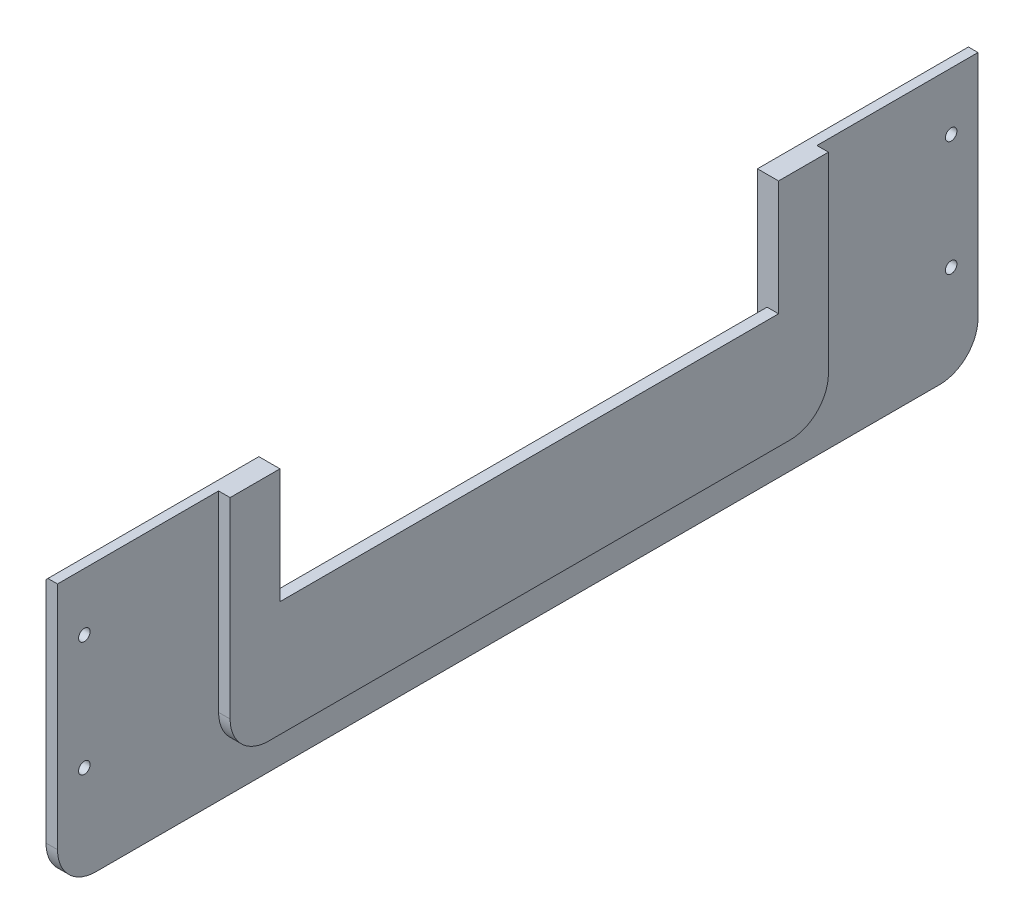
ISO-10303-21;
HEADER;
FILE_DESCRIPTION(('STEP AP214'),'2;1');
FILE_NAME('part.step','',(''),(''),'','','');
FILE_SCHEMA(('AUTOMOTIVE_DESIGN { 1 0 10303 214 1 1 1 1 }'));
ENDSEC;
DATA;
#1=APPLICATION_CONTEXT('core data for automotive mechanical design processes');
#2=APPLICATION_PROTOCOL_DEFINITION('international standard','automotive_design',2000,#1);
#3=PRODUCT_CONTEXT('',#1,'mechanical');
#4=PRODUCT('Part','Part','',(#3));
#5=PRODUCT_RELATED_PRODUCT_CATEGORY('part','',(#4));
#6=PRODUCT_DEFINITION_FORMATION('','',#4);
#7=PRODUCT_DEFINITION_CONTEXT('part definition',#1,'design');
#8=PRODUCT_DEFINITION('design','',#6,#7);
#9=PRODUCT_DEFINITION_SHAPE('','',#8);
#10=(LENGTH_UNIT() NAMED_UNIT(*) SI_UNIT(.MILLI.,.METRE.));
#11=(NAMED_UNIT(*) PLANE_ANGLE_UNIT() SI_UNIT($,.RADIAN.));
#12=(NAMED_UNIT(*) SI_UNIT($,.STERADIAN.) SOLID_ANGLE_UNIT());
#13=UNCERTAINTY_MEASURE_WITH_UNIT(LENGTH_MEASURE(1.E-05),#10,'distance_accuracy_value','');
#14=(GEOMETRIC_REPRESENTATION_CONTEXT(3) GLOBAL_UNCERTAINTY_ASSIGNED_CONTEXT((#13)) GLOBAL_UNIT_ASSIGNED_CONTEXT((#10,
#11,#12)) REPRESENTATION_CONTEXT('',''));
#15=CARTESIAN_POINT('',(0.,0.,0.));
#16=DIRECTION('',(0.,0.,1.));
#17=DIRECTION('',(1.,0.,0.));
#18=AXIS2_PLACEMENT_3D('',#15,#16,#17);
#19=CARTESIAN_POINT('',(3.,45.,120.));
#20=DIRECTION('',(0.,-1.,0.));
#21=DIRECTION('',(0.,0.,-1.));
#22=AXIS2_PLACEMENT_3D('',#19,#20,#21);
#23=PLANE('',#22);
#24=DIRECTION('',(-1.,0.,0.));
#25=VECTOR('',#24,1.);
#26=CARTESIAN_POINT('',(3.,45.,-120.));
#27=LINE('',#26,#25);
#28=CARTESIAN_POINT('',(3.,45.,-120.));
#29=VERTEX_POINT('',#28);
#30=CARTESIAN_POINT('',(0.499999999999973,45.,-120.));
#31=VERTEX_POINT('',#30);
#32=EDGE_CURVE('E348',#29,#31,#27,.T.);
#33=ORIENTED_EDGE('',*,*,#32,.T.);
#34=DIRECTION('',(0.,0.,1.));
#35=VECTOR('',#34,1.);
#36=CARTESIAN_POINT('',(0.499999999999973,45.,120.));
#37=LINE('',#36,#35);
#38=CARTESIAN_POINT('',(0.499999999999973,45.,-65.));
#39=VERTEX_POINT('',#38);
#40=EDGE_CURVE('E418',#31,#39,#37,.T.);
#41=ORIENTED_EDGE('',*,*,#40,.T.);
#42=DIRECTION('',(-1.,0.,0.));
#43=VECTOR('',#42,1.);
#44=CARTESIAN_POINT('',(3.,45.,-65.));
#45=LINE('',#44,#43);
#46=CARTESIAN_POINT('',(6.,45.,-65.));
#47=VERTEX_POINT('',#46);
#48=EDGE_CURVE('E238',#47,#39,#45,.T.);
#49=ORIENTED_EDGE('',*,*,#48,.F.);
#50=DIRECTION('',(0.,0.,1.));
#51=VECTOR('',#50,1.);
#52=CARTESIAN_POINT('',(6.,45.,78.));
#53=LINE('',#52,#51);
#54=CARTESIAN_POINT('',(6.,45.,-78.));
#55=VERTEX_POINT('',#54);
#56=EDGE_CURVE('E217',#55,#47,#53,.T.);
#57=ORIENTED_EDGE('',*,*,#56,.F.);
#58=DIRECTION('',(-1.,0.,0.));
#59=VECTOR('',#58,1.);
#60=CARTESIAN_POINT('',(6.,45.,-78.));
#61=LINE('',#60,#59);
#62=CARTESIAN_POINT('',(3.,45.,-78.));
#63=VERTEX_POINT('',#62);
#64=EDGE_CURVE('E313',#55,#63,#61,.T.);
#65=ORIENTED_EDGE('',*,*,#64,.T.);
#66=DIRECTION('',(0.,0.,1.));
#67=VECTOR('',#66,1.);
#68=CARTESIAN_POINT('',(3.,45.,120.));
#69=LINE('',#68,#67);
#70=EDGE_CURVE('E331',#29,#63,#69,.T.);
#71=ORIENTED_EDGE('',*,*,#70,.F.);
#72=EDGE_LOOP('',(#33,#41,#49,#57,#65,#71));
#73=FACE_BOUND('',#72,.T.);
#74=ADVANCED_FACE('F46',(#73),#23,.F.);
#75=CARTESIAN_POINT('',(3.,45.,120.));
#76=DIRECTION('',(0.,0.,-1.));
#77=DIRECTION('',(0.,1.,0.));
#78=AXIS2_PLACEMENT_3D('',#75,#76,#77);
#79=PLANE('',#78);
#80=DIRECTION('',(-1.,0.,0.));
#81=VECTOR('',#80,1.);
#82=CARTESIAN_POINT('',(3.,45.,120.));
#83=LINE('',#82,#81);
#84=CARTESIAN_POINT('',(3.,45.,120.));
#85=VERTEX_POINT('',#84);
#86=CARTESIAN_POINT('',(0.499999999999973,45.,120.));
#87=VERTEX_POINT('',#86);
#88=EDGE_CURVE('E335',#85,#87,#83,.T.);
#89=ORIENTED_EDGE('',*,*,#88,.T.);
#90=DIRECTION('',(0.707106781186548,0.707106781186548,0.));
#91=VECTOR('',#90,1.);
#92=CARTESIAN_POINT('',(0.499999999999973,45.,120.));
#93=LINE('',#92,#91);
#94=CARTESIAN_POINT('',(0.,44.5,120.));
#95=VERTEX_POINT('',#94);
#96=EDGE_CURVE('E409',#87,#95,#93,.F.);
#97=ORIENTED_EDGE('',*,*,#96,.T.);
#98=DIRECTION('',(0.,-1.,0.));
#99=VECTOR('',#98,1.);
#100=CARTESIAN_POINT('',(0.,45.,120.));
#101=LINE('',#100,#99);
#102=CARTESIAN_POINT('',(0.,-15.,120.));
#103=VERTEX_POINT('',#102);
#104=EDGE_CURVE('E317',#95,#103,#101,.T.);
#105=ORIENTED_EDGE('',*,*,#104,.T.);
#106=DIRECTION('',(-1.,0.,0.));
#107=VECTOR('',#106,1.);
#108=CARTESIAN_POINT('',(3.,-15.,120.));
#109=LINE('',#108,#107);
#110=CARTESIAN_POINT('',(3.,-15.,120.));
#111=VERTEX_POINT('',#110);
#112=EDGE_CURVE('E366',#103,#111,#109,.F.);
#113=ORIENTED_EDGE('',*,*,#112,.T.);
#114=DIRECTION('',(0.,-1.,0.));
#115=VECTOR('',#114,1.);
#116=CARTESIAN_POINT('',(3.,45.,120.));
#117=LINE('',#116,#115);
#118=EDGE_CURVE('E318',#85,#111,#117,.T.);
#119=ORIENTED_EDGE('',*,*,#118,.F.);
#120=EDGE_LOOP('',(#89,#97,#105,#113,#119));
#121=FACE_BOUND('',#120,.T.);
#122=ADVANCED_FACE('F510',(#121),#79,.F.);
#123=CARTESIAN_POINT('',(3.,-25.,120.));
#124=DIRECTION('',(0.,1.,0.));
#125=DIRECTION('',(0.,0.,1.));
#126=AXIS2_PLACEMENT_3D('',#123,#124,#125);
#127=PLANE('',#126);
#128=DIRECTION('',(0.,0.,-1.));
#129=VECTOR('',#128,1.);
#130=CARTESIAN_POINT('',(3.,-25.,120.));
#131=LINE('',#130,#129);
#132=CARTESIAN_POINT('',(3.,-25.,110.));
#133=VERTEX_POINT('',#132);
#134=CARTESIAN_POINT('',(3.,-25.,-110.));
#135=VERTEX_POINT('',#134);
#136=EDGE_CURVE('E322',#133,#135,#131,.T.);
#137=ORIENTED_EDGE('',*,*,#136,.F.);
#138=DIRECTION('',(-1.,0.,0.));
#139=VECTOR('',#138,1.);
#140=CARTESIAN_POINT('',(3.,-25.,110.));
#141=LINE('',#140,#139);
#142=CARTESIAN_POINT('',(0.,-25.,110.));
#143=VERTEX_POINT('',#142);
#144=EDGE_CURVE('E355',#133,#143,#141,.T.);
#145=ORIENTED_EDGE('',*,*,#144,.T.);
#146=DIRECTION('',(0.,0.,-1.));
#147=VECTOR('',#146,1.);
#148=CARTESIAN_POINT('',(0.,-25.,120.));
#149=LINE('',#148,#147);
#150=CARTESIAN_POINT('',(0.,-25.,-110.));
#151=VERTEX_POINT('',#150);
#152=EDGE_CURVE('E338',#143,#151,#149,.T.);
#153=ORIENTED_EDGE('',*,*,#152,.T.);
#154=DIRECTION('',(-1.,0.,0.));
#155=VECTOR('',#154,1.);
#156=CARTESIAN_POINT('',(3.,-25.,-110.));
#157=LINE('',#156,#155);
#158=EDGE_CURVE('E352',#151,#135,#157,.F.);
#159=ORIENTED_EDGE('',*,*,#158,.T.);
#160=EDGE_LOOP('',(#137,#145,#153,#159));
#161=FACE_BOUND('',#160,.T.);
#162=ADVANCED_FACE('F484',(#161),#127,.F.);
#163=CARTESIAN_POINT('',(3.,45.,-120.));
#164=DIRECTION('',(0.,0.,1.));
#165=DIRECTION('',(1.,0.,0.));
#166=AXIS2_PLACEMENT_3D('',#163,#164,#165);
#167=PLANE('',#166);
#168=DIRECTION('',(0.,1.,0.));
#169=VECTOR('',#168,1.);
#170=CARTESIAN_POINT('',(0.,45.,-120.));
#171=LINE('',#170,#169);
#172=CARTESIAN_POINT('',(0.,-15.,-120.));
#173=VERTEX_POINT('',#172);
#174=CARTESIAN_POINT('',(0.,44.5,-120.));
#175=VERTEX_POINT('',#174);
#176=EDGE_CURVE('E323',#173,#175,#171,.T.);
#177=ORIENTED_EDGE('',*,*,#176,.T.);
#178=DIRECTION('',(-0.707106781186548,-0.707106781186548,0.));
#179=VECTOR('',#178,1.);
#180=CARTESIAN_POINT('',(0.499999999999973,45.,-120.));
#181=LINE('',#180,#179);
#182=EDGE_CURVE('E422',#175,#31,#181,.F.);
#183=ORIENTED_EDGE('',*,*,#182,.T.);
#184=ORIENTED_EDGE('',*,*,#32,.F.);
#185=DIRECTION('',(0.,1.,0.));
#186=VECTOR('',#185,1.);
#187=CARTESIAN_POINT('',(3.,45.,-120.));
#188=LINE('',#187,#186);
#189=CARTESIAN_POINT('',(3.,-15.,-120.));
#190=VERTEX_POINT('',#189);
#191=EDGE_CURVE('E327',#190,#29,#188,.T.);
#192=ORIENTED_EDGE('',*,*,#191,.F.);
#193=DIRECTION('',(-1.,0.,0.));
#194=VECTOR('',#193,1.);
#195=CARTESIAN_POINT('',(3.,-15.,-120.));
#196=LINE('',#195,#194);
#197=EDGE_CURVE('E375',#190,#173,#196,.T.);
#198=ORIENTED_EDGE('',*,*,#197,.T.);
#199=EDGE_LOOP('',(#177,#183,#184,#192,#198));
#200=FACE_BOUND('',#199,.T.);
#201=ADVANCED_FACE('F468',(#200),#167,.F.);
#202=DIRECTION('',(-1.,0.,0.));
#203=VECTOR('',#202,1.);
#204=CARTESIAN_POINT('',(3.,45.,65.));
#205=LINE('',#204,#203);
#206=CARTESIAN_POINT('',(6.,45.,65.));
#207=VERTEX_POINT('',#206);
#208=CARTESIAN_POINT('',(0.499999999999973,45.,65.));
#209=VERTEX_POINT('',#208);
#210=EDGE_CURVE('E239',#207,#209,#205,.T.);
#211=ORIENTED_EDGE('',*,*,#210,.T.);
#212=DIRECTION('',(0.,0.,1.));
#213=VECTOR('',#212,1.);
#214=CARTESIAN_POINT('',(0.499999999999973,45.,120.));
#215=LINE('',#214,#213);
#216=EDGE_CURVE('E405',#209,#87,#215,.T.);
#217=ORIENTED_EDGE('',*,*,#216,.T.);
#218=ORIENTED_EDGE('',*,*,#88,.F.);
#219=CARTESIAN_POINT('',(3.,45.,78.));
#220=VERTEX_POINT('',#219);
#221=EDGE_CURVE('E330',#220,#85,#69,.T.);
#222=ORIENTED_EDGE('',*,*,#221,.F.);
#223=DIRECTION('',(-1.,0.,0.));
#224=VECTOR('',#223,1.);
#225=CARTESIAN_POINT('',(6.,45.,78.));
#226=LINE('',#225,#224);
#227=CARTESIAN_POINT('',(6.,45.,78.));
#228=VERTEX_POINT('',#227);
#229=EDGE_CURVE('E300',#228,#220,#226,.T.);
#230=ORIENTED_EDGE('',*,*,#229,.F.);
#231=EDGE_CURVE('E297',#207,#228,#53,.T.);
#232=ORIENTED_EDGE('',*,*,#231,.F.);
#233=EDGE_LOOP('',(#211,#217,#218,#222,#230,#232));
#234=FACE_BOUND('',#233,.T.);
#235=ADVANCED_FACE('F502',(#234),#23,.F.);
#236=CARTESIAN_POINT('',(3.,0.,0.));
#237=DIRECTION('',(1.,0.,0.));
#238=DIRECTION('',(0.,0.,-1.));
#239=AXIS2_PLACEMENT_3D('',#236,#237,#238);
#240=PLANE('',#239);
#241=CARTESIAN_POINT('',(3.,30.,-113.));
#242=DIRECTION('',(1.,0.,0.));
#243=DIRECTION('',(0.,0.,-1.));
#244=AXIS2_PLACEMENT_3D('',#241,#242,#243);
#245=CIRCLE('',#244,1.5);
#246=CARTESIAN_POINT('',(3.,30.,-114.5));
#247=VERTEX_POINT('',#246);
#248=EDGE_CURVE('E280',#247,#247,#245,.T.);
#249=ORIENTED_EDGE('',*,*,#248,.F.);
#250=EDGE_LOOP('',(#249));
#251=FACE_BOUND('',#250,.T.);
#252=CARTESIAN_POINT('',(3.,0.,-113.));
#253=DIRECTION('',(1.,0.,0.));
#254=DIRECTION('',(0.,0.,-1.));
#255=AXIS2_PLACEMENT_3D('',#252,#253,#254);
#256=CIRCLE('',#255,1.5);
#257=CARTESIAN_POINT('',(3.,0.,-114.5));
#258=VERTEX_POINT('',#257);
#259=EDGE_CURVE('E276',#258,#258,#256,.T.);
#260=ORIENTED_EDGE('',*,*,#259,.F.);
#261=EDGE_LOOP('',(#260));
#262=FACE_BOUND('',#261,.T.);
#263=CARTESIAN_POINT('',(3.,0.,113.));
#264=DIRECTION('',(1.,0.,0.));
#265=DIRECTION('',(0.,0.,-1.));
#266=AXIS2_PLACEMENT_3D('',#263,#264,#265);
#267=CIRCLE('',#266,1.5);
#268=CARTESIAN_POINT('',(3.,0.,111.5));
#269=VERTEX_POINT('',#268);
#270=EDGE_CURVE('E272',#269,#269,#267,.T.);
#271=ORIENTED_EDGE('',*,*,#270,.F.);
#272=EDGE_LOOP('',(#271));
#273=FACE_BOUND('',#272,.T.);
#274=CARTESIAN_POINT('',(3.,30.,113.));
#275=DIRECTION('',(1.,0.,0.));
#276=DIRECTION('',(0.,0.,-1.));
#277=AXIS2_PLACEMENT_3D('',#274,#275,#276);
#278=CIRCLE('',#277,1.5);
#279=CARTESIAN_POINT('',(3.,30.,111.5));
#280=VERTEX_POINT('',#279);
#281=EDGE_CURVE('E268',#280,#280,#278,.T.);
#282=ORIENTED_EDGE('',*,*,#281,.F.);
#283=EDGE_LOOP('',(#282));
#284=FACE_BOUND('',#283,.T.);
#285=ORIENTED_EDGE('',*,*,#118,.T.);
#286=CARTESIAN_POINT('',(3.,-15.,110.));
#287=DIRECTION('',(1.,0.,0.));
#288=DIRECTION('',(0.,0.,-1.));
#289=AXIS2_PLACEMENT_3D('',#286,#287,#288);
#290=CIRCLE('',#289,10.);
#291=EDGE_CURVE('E372',#111,#133,#290,.T.);
#292=ORIENTED_EDGE('',*,*,#291,.T.);
#293=ORIENTED_EDGE('',*,*,#136,.T.);
#294=CARTESIAN_POINT('',(3.,-15.,-110.));
#295=DIRECTION('',(1.,0.,0.));
#296=DIRECTION('',(0.,0.,-1.));
#297=AXIS2_PLACEMENT_3D('',#294,#295,#296);
#298=CIRCLE('',#297,10.);
#299=EDGE_CURVE('E369',#135,#190,#298,.T.);
#300=ORIENTED_EDGE('',*,*,#299,.T.);
#301=ORIENTED_EDGE('',*,*,#191,.T.);
#302=ORIENTED_EDGE('',*,*,#70,.T.);
#303=DIRECTION('',(0.,1.,0.));
#304=VECTOR('',#303,1.);
#305=CARTESIAN_POINT('',(3.,45.,-78.));
#306=LINE('',#305,#304);
#307=CARTESIAN_POINT('',(3.,-4.99999999999999,-78.));
#308=VERTEX_POINT('',#307);
#309=EDGE_CURVE('E290',#308,#63,#306,.T.);
#310=ORIENTED_EDGE('',*,*,#309,.F.);
#311=CARTESIAN_POINT('',(3.,-4.99999999999999,-68.));
#312=DIRECTION('',(1.,0.,0.));
#313=DIRECTION('',(0.,0.,-1.));
#314=AXIS2_PLACEMENT_3D('',#311,#312,#313);
#315=CIRCLE('',#314,10.);
#316=CARTESIAN_POINT('',(3.,-15.,-68.));
#317=VERTEX_POINT('',#316);
#318=EDGE_CURVE('E402',#308,#317,#315,.F.);
#319=ORIENTED_EDGE('',*,*,#318,.T.);
#320=DIRECTION('',(0.,0.,-1.));
#321=VECTOR('',#320,1.);
#322=CARTESIAN_POINT('',(3.,-15.,78.));
#323=LINE('',#322,#321);
#324=CARTESIAN_POINT('',(3.,-15.,68.));
#325=VERTEX_POINT('',#324);
#326=EDGE_CURVE('E304',#325,#317,#323,.T.);
#327=ORIENTED_EDGE('',*,*,#326,.F.);
#328=CARTESIAN_POINT('',(3.,-4.99999999999999,68.));
#329=DIRECTION('',(1.,0.,0.));
#330=DIRECTION('',(0.,0.,-1.));
#331=AXIS2_PLACEMENT_3D('',#328,#329,#330);
#332=CIRCLE('',#331,10.);
#333=CARTESIAN_POINT('',(3.,-4.99999999999999,78.));
#334=VERTEX_POINT('',#333);
#335=EDGE_CURVE('E399',#325,#334,#332,.F.);
#336=ORIENTED_EDGE('',*,*,#335,.T.);
#337=DIRECTION('',(0.,-1.,0.));
#338=VECTOR('',#337,1.);
#339=CARTESIAN_POINT('',(3.,45.,78.));
#340=LINE('',#339,#338);
#341=EDGE_CURVE('E284',#220,#334,#340,.T.);
#342=ORIENTED_EDGE('',*,*,#341,.F.);
#343=ORIENTED_EDGE('',*,*,#221,.T.);
#344=EDGE_LOOP('',(#285,#292,#293,#300,#301,#302,#310,#319,#327,#336,#342,#343));
#345=FACE_BOUND('',#344,.T.);
#346=ADVANCED_FACE('F475',(#251,#262,#273,#284,#345),#240,.T.);
#347=CARTESIAN_POINT('',(0.,0.,0.));
#348=DIRECTION('',(1.,0.,0.));
#349=DIRECTION('',(0.,0.,-1.));
#350=AXIS2_PLACEMENT_3D('',#347,#348,#349);
#351=PLANE('',#350);
#352=CARTESIAN_POINT('',(0.,30.,-113.));
#353=DIRECTION('',(-1.,0.,0.));
#354=DIRECTION('',(0.,0.,-1.));
#355=AXIS2_PLACEMENT_3D('',#352,#353,#354);
#356=CIRCLE('',#355,1.5);
#357=CARTESIAN_POINT('',(0.,30.,-114.5));
#358=VERTEX_POINT('',#357);
#359=EDGE_CURVE('E243',#358,#358,#356,.T.);
#360=ORIENTED_EDGE('',*,*,#359,.F.);
#361=EDGE_LOOP('',(#360));
#362=FACE_BOUND('',#361,.T.);
#363=CARTESIAN_POINT('',(0.,0.,-113.));
#364=DIRECTION('',(-1.,0.,0.));
#365=DIRECTION('',(0.,0.,-1.));
#366=AXIS2_PLACEMENT_3D('',#363,#364,#365);
#367=CIRCLE('',#366,1.5);
#368=CARTESIAN_POINT('',(0.,0.,-114.5));
#369=VERTEX_POINT('',#368);
#370=EDGE_CURVE('E258',#369,#369,#367,.T.);
#371=ORIENTED_EDGE('',*,*,#370,.F.);
#372=EDGE_LOOP('',(#371));
#373=FACE_BOUND('',#372,.T.);
#374=CARTESIAN_POINT('',(0.,0.,113.));
#375=DIRECTION('',(-1.,0.,0.));
#376=DIRECTION('',(0.,0.,1.));
#377=AXIS2_PLACEMENT_3D('',#374,#375,#376);
#378=CIRCLE('',#377,1.5);
#379=CARTESIAN_POINT('',(0.,0.,114.5));
#380=VERTEX_POINT('',#379);
#381=EDGE_CURVE('E253',#380,#380,#378,.T.);
#382=ORIENTED_EDGE('',*,*,#381,.F.);
#383=EDGE_LOOP('',(#382));
#384=FACE_BOUND('',#383,.T.);
#385=CARTESIAN_POINT('',(0.,30.,113.));
#386=DIRECTION('',(-1.,0.,0.));
#387=DIRECTION('',(0.,0.,1.));
#388=AXIS2_PLACEMENT_3D('',#385,#386,#387);
#389=CIRCLE('',#388,1.5);
#390=CARTESIAN_POINT('',(0.,30.,114.5));
#391=VERTEX_POINT('',#390);
#392=EDGE_CURVE('E257',#391,#391,#389,.T.);
#393=ORIENTED_EDGE('',*,*,#392,.F.);
#394=EDGE_LOOP('',(#393));
#395=FACE_BOUND('',#394,.T.);
#396=DIRECTION('',(0.,0.,-1.));
#397=VECTOR('',#396,1.);
#398=CARTESIAN_POINT('',(0.,44.5,0.));
#399=LINE('',#398,#397);
#400=CARTESIAN_POINT('',(0.,44.5,65.5));
#401=VERTEX_POINT('',#400);
#402=EDGE_CURVE('E415',#95,#401,#399,.T.);
#403=ORIENTED_EDGE('',*,*,#402,.T.);
#404=DIRECTION('',(0.,-1.,0.));
#405=VECTOR('',#404,1.);
#406=CARTESIAN_POINT('',(0.,0.,65.5));
#407=LINE('',#406,#405);
#408=CARTESIAN_POINT('',(0.,-5.49999999999997,65.5));
#409=VERTEX_POINT('',#408);
#410=EDGE_CURVE('E72',#401,#409,#407,.T.);
#411=ORIENTED_EDGE('',*,*,#410,.T.);
#412=DIRECTION('',(0.,0.,-1.));
#413=VECTOR('',#412,1.);
#414=CARTESIAN_POINT('',(0.,-5.49999999999997,0.));
#415=LINE('',#414,#413);
#416=CARTESIAN_POINT('',(0.,-5.49999999999997,-65.5));
#417=VERTEX_POINT('',#416);
#418=EDGE_CURVE('E435',#409,#417,#415,.T.);
#419=ORIENTED_EDGE('',*,*,#418,.T.);
#420=DIRECTION('',(0.,1.,0.));
#421=VECTOR('',#420,1.);
#422=CARTESIAN_POINT('',(0.,0.,-65.5));
#423=LINE('',#422,#421);
#424=CARTESIAN_POINT('',(0.,44.5,-65.5));
#425=VERTEX_POINT('',#424);
#426=EDGE_CURVE('E432',#417,#425,#423,.T.);
#427=ORIENTED_EDGE('',*,*,#426,.T.);
#428=DIRECTION('',(0.,0.,-1.));
#429=VECTOR('',#428,1.);
#430=CARTESIAN_POINT('',(0.,44.5,0.));
#431=LINE('',#430,#429);
#432=EDGE_CURVE('E412',#425,#175,#431,.T.);
#433=ORIENTED_EDGE('',*,*,#432,.T.);
#434=ORIENTED_EDGE('',*,*,#176,.F.);
#435=CARTESIAN_POINT('',(0.,-15.,-110.));
#436=DIRECTION('',(1.,0.,0.));
#437=DIRECTION('',(0.,0.,-1.));
#438=AXIS2_PLACEMENT_3D('',#435,#436,#437);
#439=CIRCLE('',#438,10.);
#440=EDGE_CURVE('E359',#173,#151,#439,.F.);
#441=ORIENTED_EDGE('',*,*,#440,.T.);
#442=ORIENTED_EDGE('',*,*,#152,.F.);
#443=CARTESIAN_POINT('',(0.,-15.,110.));
#444=DIRECTION('',(1.,0.,0.));
#445=DIRECTION('',(0.,0.,-1.));
#446=AXIS2_PLACEMENT_3D('',#443,#444,#445);
#447=CIRCLE('',#446,10.);
#448=EDGE_CURVE('E362',#143,#103,#447,.F.);
#449=ORIENTED_EDGE('',*,*,#448,.T.);
#450=ORIENTED_EDGE('',*,*,#104,.F.);
#451=EDGE_LOOP('',(#403,#411,#419,#427,#433,#434,#441,#442,#449,#450));
#452=FACE_BOUND('',#451,.T.);
#453=ADVANCED_FACE('F460',(#362,#373,#384,#395,#452),#351,.F.);
#454=CARTESIAN_POINT('',(6.,45.,78.));
#455=DIRECTION('',(0.,0.,-1.));
#456=DIRECTION('',(0.,1.,0.));
#457=AXIS2_PLACEMENT_3D('',#454,#455,#456);
#458=PLANE('',#457);
#459=ORIENTED_EDGE('',*,*,#341,.T.);
#460=DIRECTION('',(-1.,0.,0.));
#461=VECTOR('',#460,1.);
#462=CARTESIAN_POINT('',(6.,-4.99999999999999,78.));
#463=LINE('',#462,#461);
#464=CARTESIAN_POINT('',(6.,-4.99999999999999,78.));
#465=VERTEX_POINT('',#464);
#466=EDGE_CURVE('E386',#334,#465,#463,.F.);
#467=ORIENTED_EDGE('',*,*,#466,.T.);
#468=DIRECTION('',(0.,-1.,0.));
#469=VECTOR('',#468,1.);
#470=CARTESIAN_POINT('',(6.,45.,78.));
#471=LINE('',#470,#469);
#472=EDGE_CURVE('E285',#228,#465,#471,.T.);
#473=ORIENTED_EDGE('',*,*,#472,.F.);
#474=ORIENTED_EDGE('',*,*,#229,.T.);
#475=EDGE_LOOP('',(#459,#467,#473,#474));
#476=FACE_BOUND('',#475,.T.);
#477=ADVANCED_FACE('F602',(#476),#458,.F.);
#478=CARTESIAN_POINT('',(6.,-15.,78.));
#479=DIRECTION('',(0.,1.,0.));
#480=DIRECTION('',(0.,0.,1.));
#481=AXIS2_PLACEMENT_3D('',#478,#479,#480);
#482=PLANE('',#481);
#483=DIRECTION('',(0.,0.,-1.));
#484=VECTOR('',#483,1.);
#485=CARTESIAN_POINT('',(6.,-15.,78.));
#486=LINE('',#485,#484);
#487=CARTESIAN_POINT('',(6.,-15.,68.));
#488=VERTEX_POINT('',#487);
#489=CARTESIAN_POINT('',(6.,-15.,-68.));
#490=VERTEX_POINT('',#489);
#491=EDGE_CURVE('E289',#488,#490,#486,.T.);
#492=ORIENTED_EDGE('',*,*,#491,.F.);
#493=DIRECTION('',(-1.,0.,0.));
#494=VECTOR('',#493,1.);
#495=CARTESIAN_POINT('',(6.,-15.,68.));
#496=LINE('',#495,#494);
#497=EDGE_CURVE('E382',#488,#325,#496,.T.);
#498=ORIENTED_EDGE('',*,*,#497,.T.);
#499=ORIENTED_EDGE('',*,*,#326,.T.);
#500=DIRECTION('',(-1.,0.,0.));
#501=VECTOR('',#500,1.);
#502=CARTESIAN_POINT('',(6.,-15.,-68.));
#503=LINE('',#502,#501);
#504=EDGE_CURVE('E379',#317,#490,#503,.F.);
#505=ORIENTED_EDGE('',*,*,#504,.T.);
#506=EDGE_LOOP('',(#492,#498,#499,#505));
#507=FACE_BOUND('',#506,.T.);
#508=ADVANCED_FACE('F647',(#507),#482,.F.);
#509=CARTESIAN_POINT('',(6.,45.,-78.));
#510=DIRECTION('',(0.,0.,1.));
#511=DIRECTION('',(0.,-1.,0.));
#512=AXIS2_PLACEMENT_3D('',#509,#510,#511);
#513=PLANE('',#512);
#514=DIRECTION('',(0.,1.,0.));
#515=VECTOR('',#514,1.);
#516=CARTESIAN_POINT('',(6.,45.,-78.));
#517=LINE('',#516,#515);
#518=CARTESIAN_POINT('',(6.,-4.99999999999999,-78.));
#519=VERTEX_POINT('',#518);
#520=EDGE_CURVE('E294',#519,#55,#517,.T.);
#521=ORIENTED_EDGE('',*,*,#520,.F.);
#522=DIRECTION('',(-1.,0.,0.));
#523=VECTOR('',#522,1.);
#524=CARTESIAN_POINT('',(6.,-4.99999999999999,-78.));
#525=LINE('',#524,#523);
#526=EDGE_CURVE('E395',#519,#308,#525,.T.);
#527=ORIENTED_EDGE('',*,*,#526,.T.);
#528=ORIENTED_EDGE('',*,*,#309,.T.);
#529=ORIENTED_EDGE('',*,*,#64,.F.);
#530=EDGE_LOOP('',(#521,#527,#528,#529));
#531=FACE_BOUND('',#530,.T.);
#532=ADVANCED_FACE('F656',(#531),#513,.F.);
#533=CARTESIAN_POINT('',(6.,0.,0.));
#534=DIRECTION('',(1.,0.,0.));
#535=DIRECTION('',(0.,0.,-1.));
#536=AXIS2_PLACEMENT_3D('',#533,#534,#535);
#537=PLANE('',#536);
#538=DIRECTION('',(0.,-1.,0.));
#539=VECTOR('',#538,1.);
#540=CARTESIAN_POINT('',(6.,45.,-65.));
#541=LINE('',#540,#539);
#542=CARTESIAN_POINT('',(6.,15.,-65.));
#543=VERTEX_POINT('',#542);
#544=EDGE_CURVE('E197',#47,#543,#541,.T.);
#545=ORIENTED_EDGE('',*,*,#544,.T.);
#546=DIRECTION('',(0.,0.,1.));
#547=VECTOR('',#546,1.);
#548=CARTESIAN_POINT('',(6.,15.,-65.));
#549=LINE('',#548,#547);
#550=CARTESIAN_POINT('',(6.,15.,65.));
#551=VERTEX_POINT('',#550);
#552=EDGE_CURVE('E208',#543,#551,#549,.T.);
#553=ORIENTED_EDGE('',*,*,#552,.T.);
#554=DIRECTION('',(0.,1.,0.));
#555=VECTOR('',#554,1.);
#556=CARTESIAN_POINT('',(6.,45.,65.));
#557=LINE('',#556,#555);
#558=EDGE_CURVE('E205',#551,#207,#557,.T.);
#559=ORIENTED_EDGE('',*,*,#558,.T.);
#560=ORIENTED_EDGE('',*,*,#231,.T.);
#561=ORIENTED_EDGE('',*,*,#472,.T.);
#562=CARTESIAN_POINT('',(6.,-4.99999999999999,68.));
#563=DIRECTION('',(1.,0.,0.));
#564=DIRECTION('',(0.,0.,-1.));
#565=AXIS2_PLACEMENT_3D('',#562,#563,#564);
#566=CIRCLE('',#565,10.);
#567=EDGE_CURVE('E392',#465,#488,#566,.T.);
#568=ORIENTED_EDGE('',*,*,#567,.T.);
#569=ORIENTED_EDGE('',*,*,#491,.T.);
#570=CARTESIAN_POINT('',(6.,-4.99999999999999,-68.));
#571=DIRECTION('',(1.,0.,0.));
#572=DIRECTION('',(0.,0.,-1.));
#573=AXIS2_PLACEMENT_3D('',#570,#571,#572);
#574=CIRCLE('',#573,10.);
#575=EDGE_CURVE('E389',#490,#519,#574,.T.);
#576=ORIENTED_EDGE('',*,*,#575,.T.);
#577=ORIENTED_EDGE('',*,*,#520,.T.);
#578=ORIENTED_EDGE('',*,*,#56,.T.);
#579=EDGE_LOOP('',(#545,#553,#559,#560,#561,#568,#569,#576,#577,#578));
#580=FACE_BOUND('',#579,.T.);
#581=ADVANCED_FACE('F215',(#580),#537,.T.);
#582=CARTESIAN_POINT('',(20.,30.,113.));
#583=DIRECTION('',(-1.,0.,0.));
#584=DIRECTION('',(0.,0.,1.));
#585=AXIS2_PLACEMENT_3D('',#582,#583,#584);
#586=CYLINDRICAL_SURFACE('',#585,1.5);
#587=ORIENTED_EDGE('',*,*,#281,.T.);
#588=EDGE_LOOP('',(#587));
#589=FACE_BOUND('',#588,.T.);
#590=ORIENTED_EDGE('',*,*,#392,.T.);
#591=EDGE_LOOP('',(#590));
#592=FACE_BOUND('',#591,.T.);
#593=ADVANCED_FACE('F683',(#589,#592),#586,.F.);
#594=CARTESIAN_POINT('',(20.,0.,113.));
#595=DIRECTION('',(-1.,0.,0.));
#596=DIRECTION('',(0.,0.,1.));
#597=AXIS2_PLACEMENT_3D('',#594,#595,#596);
#598=CYLINDRICAL_SURFACE('',#597,1.5);
#599=ORIENTED_EDGE('',*,*,#270,.T.);
#600=EDGE_LOOP('',(#599));
#601=FACE_BOUND('',#600,.T.);
#602=ORIENTED_EDGE('',*,*,#381,.T.);
#603=EDGE_LOOP('',(#602));
#604=FACE_BOUND('',#603,.T.);
#605=ADVANCED_FACE('F715',(#601,#604),#598,.F.);
#606=CARTESIAN_POINT('',(20.,0.,-113.));
#607=DIRECTION('',(-1.,0.,0.));
#608=DIRECTION('',(0.,0.,1.));
#609=AXIS2_PLACEMENT_3D('',#606,#607,#608);
#610=CYLINDRICAL_SURFACE('',#609,1.5);
#611=ORIENTED_EDGE('',*,*,#259,.T.);
#612=EDGE_LOOP('',(#611));
#613=FACE_BOUND('',#612,.T.);
#614=ORIENTED_EDGE('',*,*,#370,.T.);
#615=EDGE_LOOP('',(#614));
#616=FACE_BOUND('',#615,.T.);
#617=ADVANCED_FACE('F718',(#613,#616),#610,.F.);
#618=CARTESIAN_POINT('',(20.,30.,-113.));
#619=DIRECTION('',(-1.,0.,0.));
#620=DIRECTION('',(0.,0.,1.));
#621=AXIS2_PLACEMENT_3D('',#618,#619,#620);
#622=CYLINDRICAL_SURFACE('',#621,1.5);
#623=ORIENTED_EDGE('',*,*,#248,.T.);
#624=EDGE_LOOP('',(#623));
#625=FACE_BOUND('',#624,.T.);
#626=ORIENTED_EDGE('',*,*,#359,.T.);
#627=EDGE_LOOP('',(#626));
#628=FACE_BOUND('',#627,.T.);
#629=ADVANCED_FACE('F525',(#625,#628),#622,.F.);
#630=CARTESIAN_POINT('',(3.,-15.,110.));
#631=DIRECTION('',(-1.,0.,0.));
#632=DIRECTION('',(0.,0.,1.));
#633=AXIS2_PLACEMENT_3D('',#630,#631,#632);
#634=CYLINDRICAL_SURFACE('',#633,10.);
#635=ORIENTED_EDGE('',*,*,#291,.F.);
#636=ORIENTED_EDGE('',*,*,#112,.F.);
#637=ORIENTED_EDGE('',*,*,#448,.F.);
#638=ORIENTED_EDGE('',*,*,#144,.F.);
#639=EDGE_LOOP('',(#635,#636,#637,#638));
#640=FACE_BOUND('',#639,.T.);
#641=ADVANCED_FACE('F488',(#640),#634,.T.);
#642=CARTESIAN_POINT('',(3.,-15.,-110.));
#643=DIRECTION('',(-1.,0.,0.));
#644=DIRECTION('',(0.,0.,1.));
#645=AXIS2_PLACEMENT_3D('',#642,#643,#644);
#646=CYLINDRICAL_SURFACE('',#645,10.);
#647=ORIENTED_EDGE('',*,*,#299,.F.);
#648=ORIENTED_EDGE('',*,*,#158,.F.);
#649=ORIENTED_EDGE('',*,*,#440,.F.);
#650=ORIENTED_EDGE('',*,*,#197,.F.);
#651=EDGE_LOOP('',(#647,#648,#649,#650));
#652=FACE_BOUND('',#651,.T.);
#653=ADVANCED_FACE('F479',(#652),#646,.T.);
#654=CARTESIAN_POINT('',(6.,-4.99999999999999,68.));
#655=DIRECTION('',(-1.,0.,0.));
#656=DIRECTION('',(0.,0.,1.));
#657=AXIS2_PLACEMENT_3D('',#654,#655,#656);
#658=CYLINDRICAL_SURFACE('',#657,10.);
#659=ORIENTED_EDGE('',*,*,#567,.F.);
#660=ORIENTED_EDGE('',*,*,#466,.F.);
#661=ORIENTED_EDGE('',*,*,#335,.F.);
#662=ORIENTED_EDGE('',*,*,#497,.F.);
#663=EDGE_LOOP('',(#659,#660,#661,#662));
#664=FACE_BOUND('',#663,.T.);
#665=ADVANCED_FACE('F528',(#664),#658,.T.);
#666=CARTESIAN_POINT('',(6.,-4.99999999999999,-68.));
#667=DIRECTION('',(-1.,0.,0.));
#668=DIRECTION('',(0.,0.,1.));
#669=AXIS2_PLACEMENT_3D('',#666,#667,#668);
#670=CYLINDRICAL_SURFACE('',#669,10.);
#671=ORIENTED_EDGE('',*,*,#575,.F.);
#672=ORIENTED_EDGE('',*,*,#504,.F.);
#673=ORIENTED_EDGE('',*,*,#318,.F.);
#674=ORIENTED_EDGE('',*,*,#526,.F.);
#675=EDGE_LOOP('',(#671,#672,#673,#674));
#676=FACE_BOUND('',#675,.T.);
#677=ADVANCED_FACE('F531',(#676),#670,.T.);
#678=CARTESIAN_POINT('',(3.,-5.,65.));
#679=DIRECTION('',(0.,0.,1.));
#680=DIRECTION('',(0.,-1.,0.));
#681=AXIS2_PLACEMENT_3D('',#678,#679,#680);
#682=PLANE('',#681);
#683=DIRECTION('',(-1.,0.,0.));
#684=VECTOR('',#683,1.);
#685=CARTESIAN_POINT('',(3.,-5.,65.));
#686=LINE('',#685,#684);
#687=CARTESIAN_POINT('',(3.,-5.,65.));
#688=VERTEX_POINT('',#687);
#689=CARTESIAN_POINT('',(0.499999999999973,-5.,65.));
#690=VERTEX_POINT('',#689);
#691=EDGE_CURVE('E244',#688,#690,#686,.T.);
#692=ORIENTED_EDGE('',*,*,#691,.T.);
#693=DIRECTION('',(0.,1.,0.));
#694=VECTOR('',#693,1.);
#695=CARTESIAN_POINT('',(0.499999999999973,-5.,65.));
#696=LINE('',#695,#694);
#697=EDGE_CURVE('E425',#690,#209,#696,.T.);
#698=ORIENTED_EDGE('',*,*,#697,.T.);
#699=ORIENTED_EDGE('',*,*,#210,.F.);
#700=ORIENTED_EDGE('',*,*,#558,.F.);
#701=DIRECTION('',(-1.,0.,0.));
#702=VECTOR('',#701,1.);
#703=CARTESIAN_POINT('',(6.,15.,65.));
#704=LINE('',#703,#702);
#705=CARTESIAN_POINT('',(3.,15.,65.));
#706=VERTEX_POINT('',#705);
#707=EDGE_CURVE('E204',#551,#706,#704,.T.);
#708=ORIENTED_EDGE('',*,*,#707,.T.);
#709=DIRECTION('',(0.,1.,0.));
#710=VECTOR('',#709,1.);
#711=CARTESIAN_POINT('',(3.,-5.,65.));
#712=LINE('',#711,#710);
#713=EDGE_CURVE('E234',#688,#706,#712,.T.);
#714=ORIENTED_EDGE('',*,*,#713,.F.);
#715=EDGE_LOOP('',(#692,#698,#699,#700,#708,#714));
#716=FACE_BOUND('',#715,.T.);
#717=ADVANCED_FACE('F498',(#716),#682,.F.);
#718=CARTESIAN_POINT('',(3.,-5.,-65.));
#719=DIRECTION('',(0.,-1.,0.));
#720=DIRECTION('',(0.,0.,-1.));
#721=AXIS2_PLACEMENT_3D('',#718,#719,#720);
#722=PLANE('',#721);
#723=DIRECTION('',(-1.,0.,0.));
#724=VECTOR('',#723,1.);
#725=CARTESIAN_POINT('',(3.,-5.,-65.));
#726=LINE('',#725,#724);
#727=CARTESIAN_POINT('',(3.,-5.,-65.));
#728=VERTEX_POINT('',#727);
#729=CARTESIAN_POINT('',(0.499999999999973,-5.,-65.));
#730=VERTEX_POINT('',#729);
#731=EDGE_CURVE('E248',#728,#730,#726,.T.);
#732=ORIENTED_EDGE('',*,*,#731,.T.);
#733=DIRECTION('',(0.,0.,1.));
#734=VECTOR('',#733,1.);
#735=CARTESIAN_POINT('',(0.499999999999973,-5.,-65.));
#736=LINE('',#735,#734);
#737=EDGE_CURVE('E440',#730,#690,#736,.T.);
#738=ORIENTED_EDGE('',*,*,#737,.T.);
#739=ORIENTED_EDGE('',*,*,#691,.F.);
#740=DIRECTION('',(0.,0.,1.));
#741=VECTOR('',#740,1.);
#742=CARTESIAN_POINT('',(3.,-5.,-65.));
#743=LINE('',#742,#741);
#744=EDGE_CURVE('E230',#728,#688,#743,.T.);
#745=ORIENTED_EDGE('',*,*,#744,.F.);
#746=EDGE_LOOP('',(#732,#738,#739,#745));
#747=FACE_BOUND('',#746,.T.);
#748=ADVANCED_FACE('F578',(#747),#722,.F.);
#749=CARTESIAN_POINT('',(3.,45.,-65.));
#750=DIRECTION('',(0.,0.,-1.));
#751=DIRECTION('',(-1.,0.,0.));
#752=AXIS2_PLACEMENT_3D('',#749,#750,#751);
#753=PLANE('',#752);
#754=ORIENTED_EDGE('',*,*,#48,.T.);
#755=DIRECTION('',(0.,-1.,0.));
#756=VECTOR('',#755,1.);
#757=CARTESIAN_POINT('',(0.499999999999973,45.,-65.));
#758=LINE('',#757,#756);
#759=EDGE_CURVE('E57',#39,#730,#758,.T.);
#760=ORIENTED_EDGE('',*,*,#759,.T.);
#761=ORIENTED_EDGE('',*,*,#731,.F.);
#762=DIRECTION('',(0.,-1.,0.));
#763=VECTOR('',#762,1.);
#764=CARTESIAN_POINT('',(3.,45.,-65.));
#765=LINE('',#764,#763);
#766=CARTESIAN_POINT('',(3.,15.,-65.));
#767=VERTEX_POINT('',#766);
#768=EDGE_CURVE('E199',#767,#728,#765,.T.);
#769=ORIENTED_EDGE('',*,*,#768,.F.);
#770=DIRECTION('',(-1.,0.,0.));
#771=VECTOR('',#770,1.);
#772=CARTESIAN_POINT('',(6.,15.,-65.));
#773=LINE('',#772,#771);
#774=EDGE_CURVE('E193',#543,#767,#773,.T.);
#775=ORIENTED_EDGE('',*,*,#774,.F.);
#776=ORIENTED_EDGE('',*,*,#544,.F.);
#777=EDGE_LOOP('',(#754,#760,#761,#769,#775,#776));
#778=FACE_BOUND('',#777,.T.);
#779=ADVANCED_FACE('F195',(#778),#753,.F.);
#780=CARTESIAN_POINT('',(3.,0.,0.));
#781=DIRECTION('',(-1.,0.,0.));
#782=DIRECTION('',(0.,0.,1.));
#783=AXIS2_PLACEMENT_3D('',#780,#781,#782);
#784=PLANE('',#783);
#785=DIRECTION('',(0.,0.,1.));
#786=VECTOR('',#785,1.);
#787=CARTESIAN_POINT('',(3.,15.,-65.));
#788=LINE('',#787,#786);
#789=EDGE_CURVE('E219',#767,#706,#788,.T.);
#790=ORIENTED_EDGE('',*,*,#789,.F.);
#791=ORIENTED_EDGE('',*,*,#768,.T.);
#792=ORIENTED_EDGE('',*,*,#744,.T.);
#793=ORIENTED_EDGE('',*,*,#713,.T.);
#794=EDGE_LOOP('',(#790,#791,#792,#793));
#795=FACE_BOUND('',#794,.T.);
#796=ADVANCED_FACE('F577',(#795),#784,.T.);
#797=CARTESIAN_POINT('',(6.,15.,-65.));
#798=DIRECTION('',(0.,-1.,0.));
#799=DIRECTION('',(0.,0.,-1.));
#800=AXIS2_PLACEMENT_3D('',#797,#798,#799);
#801=PLANE('',#800);
#802=ORIENTED_EDGE('',*,*,#789,.T.);
#803=ORIENTED_EDGE('',*,*,#707,.F.);
#804=ORIENTED_EDGE('',*,*,#552,.F.);
#805=ORIENTED_EDGE('',*,*,#774,.T.);
#806=EDGE_LOOP('',(#802,#803,#804,#805));
#807=FACE_BOUND('',#806,.T.);
#808=ADVANCED_FACE('F209',(#807),#801,.F.);
#809=CARTESIAN_POINT('',(0.499999999999973,45.,120.));
#810=DIRECTION('',(0.707106781186547,-0.707106781186547,0.));
#811=DIRECTION('',(0.,0.,1.));
#812=AXIS2_PLACEMENT_3D('',#809,#810,#811);
#813=PLANE('',#812);
#814=ORIENTED_EDGE('',*,*,#216,.F.);
#815=DIRECTION('',(-0.577350269189625,-0.577350269189625,0.577350269189627));
#816=VECTOR('',#815,1.);
#817=CARTESIAN_POINT('',(-17.8333333333334,26.6666666666667,83.3333333333334));
#818=LINE('',#817,#816);
#819=EDGE_CURVE('E429',#209,#401,#818,.T.);
#820=ORIENTED_EDGE('',*,*,#819,.T.);
#821=ORIENTED_EDGE('',*,*,#402,.F.);
#822=ORIENTED_EDGE('',*,*,#96,.F.);
#823=EDGE_LOOP('',(#814,#820,#821,#822));
#824=FACE_BOUND('',#823,.T.);
#825=ADVANCED_FACE('F495',(#824),#813,.F.);
#826=CARTESIAN_POINT('',(0.499999999999973,45.,120.));
#827=DIRECTION('',(0.707106781186547,-0.707106781186547,0.));
#828=DIRECTION('',(0.,0.,1.));
#829=AXIS2_PLACEMENT_3D('',#826,#827,#828);
#830=PLANE('',#829);
#831=ORIENTED_EDGE('',*,*,#432,.F.);
#832=DIRECTION('',(0.577350269189626,0.577350269189626,0.577350269189626));
#833=VECTOR('',#832,1.);
#834=CARTESIAN_POINT('',(62.1666666666667,106.666666666667,-3.33333333333335));
#835=LINE('',#834,#833);
#836=EDGE_CURVE('E11',#425,#39,#835,.T.);
#837=ORIENTED_EDGE('',*,*,#836,.T.);
#838=ORIENTED_EDGE('',*,*,#40,.F.);
#839=ORIENTED_EDGE('',*,*,#182,.F.);
#840=EDGE_LOOP('',(#831,#837,#838,#839));
#841=FACE_BOUND('',#840,.T.);
#842=ADVANCED_FACE('F464',(#841),#830,.F.);
#843=CARTESIAN_POINT('',(0.499999999999973,45.,-65.));
#844=DIRECTION('',(0.707106781186547,0.,-0.707106781186547));
#845=DIRECTION('',(0.,-1.,0.));
#846=AXIS2_PLACEMENT_3D('',#843,#844,#845);
#847=PLANE('',#846);
#848=ORIENTED_EDGE('',*,*,#836,.F.);
#849=ORIENTED_EDGE('',*,*,#426,.F.);
#850=DIRECTION('',(0.577350269189626,0.577350269189626,0.577350269189626));
#851=VECTOR('',#850,1.);
#852=CARTESIAN_POINT('',(0.499999999999973,-5.,-65.));
#853=LINE('',#852,#851);
#854=EDGE_CURVE('E51',#730,#417,#853,.F.);
#855=ORIENTED_EDGE('',*,*,#854,.F.);
#856=ORIENTED_EDGE('',*,*,#759,.F.);
#857=EDGE_LOOP('',(#848,#849,#855,#856));
#858=FACE_BOUND('',#857,.T.);
#859=ADVANCED_FACE('F49',(#858),#847,.F.);
#860=CARTESIAN_POINT('',(0.499999999999973,-5.,-65.));
#861=DIRECTION('',(0.707106781186547,-0.707106781186548,0.));
#862=DIRECTION('',(0.,0.,1.));
#863=AXIS2_PLACEMENT_3D('',#860,#861,#862);
#864=PLANE('',#863);
#865=ORIENTED_EDGE('',*,*,#854,.T.);
#866=ORIENTED_EDGE('',*,*,#418,.F.);
#867=DIRECTION('',(0.577350269189625,0.577350269189625,-0.577350269189627));
#868=VECTOR('',#867,1.);
#869=CARTESIAN_POINT('',(0.499999999999973,-5.,65.));
#870=LINE('',#869,#868);
#871=EDGE_CURVE('E444',#690,#409,#870,.F.);
#872=ORIENTED_EDGE('',*,*,#871,.F.);
#873=ORIENTED_EDGE('',*,*,#737,.F.);
#874=EDGE_LOOP('',(#865,#866,#872,#873));
#875=FACE_BOUND('',#874,.T.);
#876=ADVANCED_FACE('F455',(#875),#864,.F.);
#877=CARTESIAN_POINT('',(0.499999999999973,-5.,65.));
#878=DIRECTION('',(0.707106781186549,0.,0.707106781186547));
#879=DIRECTION('',(0.,1.,0.));
#880=AXIS2_PLACEMENT_3D('',#877,#878,#879);
#881=PLANE('',#880);
#882=ORIENTED_EDGE('',*,*,#871,.T.);
#883=ORIENTED_EDGE('',*,*,#410,.F.);
#884=ORIENTED_EDGE('',*,*,#819,.F.);
#885=ORIENTED_EDGE('',*,*,#697,.F.);
#886=EDGE_LOOP('',(#882,#883,#884,#885));
#887=FACE_BOUND('',#886,.T.);
#888=ADVANCED_FACE('F496',(#887),#881,.F.);
#889=CLOSED_SHELL('',(#74,#122,#162,#201,#235,#346,#453,#477,#508,#532,#581,#593,#605,#617,#629,
#641,#653,#665,#677,#717,#748,#779,#796,#808,#825,#842,#859,#876,#888));
#890=MANIFOLD_SOLID_BREP('B2',#889);
#891=ADVANCED_BREP_SHAPE_REPRESENTATION('',(#18,#890),#14);
#892=SHAPE_DEFINITION_REPRESENTATION(#9,#891);
ENDSEC;
END-ISO-10303-21;
